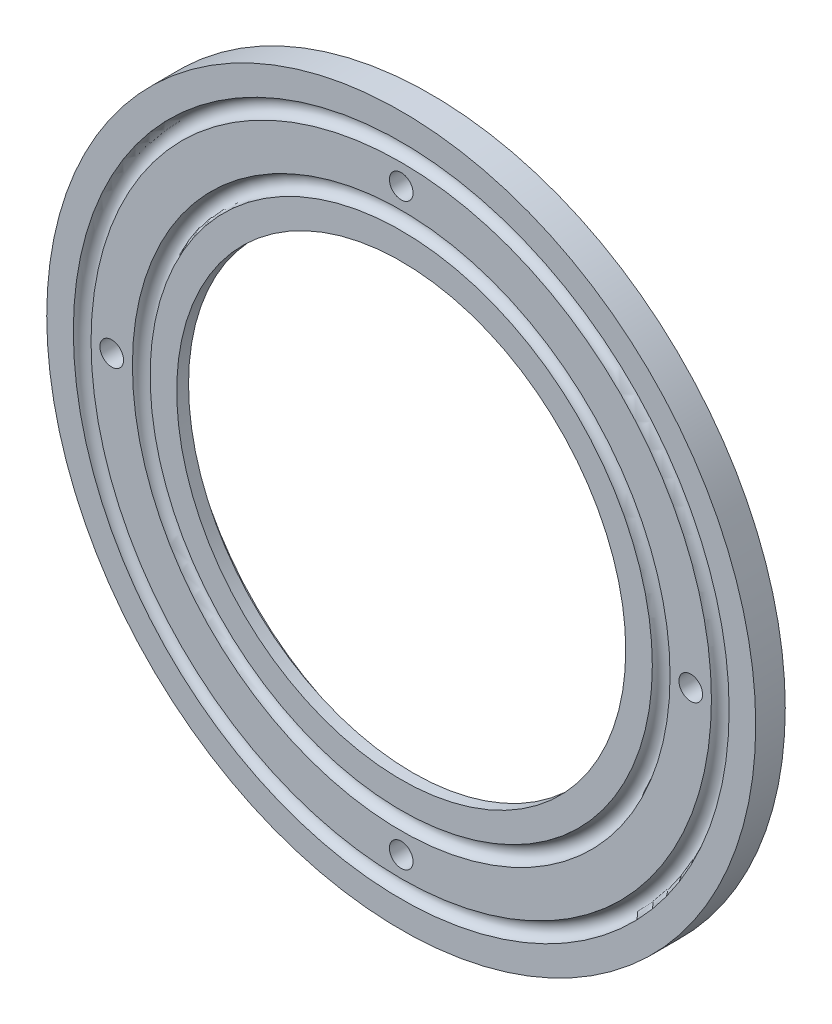
ISO-10303-21;
HEADER;
FILE_DESCRIPTION(('STEP AP214'),'2;1');
FILE_NAME('part.step','',(''),(''),'','','');
FILE_SCHEMA(('AUTOMOTIVE_DESIGN { 1 0 10303 214 1 1 1 1 }'));
ENDSEC;
DATA;
#1=APPLICATION_CONTEXT('core data for automotive mechanical design processes');
#2=APPLICATION_PROTOCOL_DEFINITION('international standard','automotive_design',2000,#1);
#3=PRODUCT_CONTEXT('',#1,'mechanical');
#4=PRODUCT('Part','Part','',(#3));
#5=PRODUCT_RELATED_PRODUCT_CATEGORY('part','',(#4));
#6=PRODUCT_DEFINITION_FORMATION('','',#4);
#7=PRODUCT_DEFINITION_CONTEXT('part definition',#1,'design');
#8=PRODUCT_DEFINITION('design','',#6,#7);
#9=PRODUCT_DEFINITION_SHAPE('','',#8);
#10=(LENGTH_UNIT() NAMED_UNIT(*) SI_UNIT(.MILLI.,.METRE.));
#11=(NAMED_UNIT(*) PLANE_ANGLE_UNIT() SI_UNIT($,.RADIAN.));
#12=(NAMED_UNIT(*) SI_UNIT($,.STERADIAN.) SOLID_ANGLE_UNIT());
#13=UNCERTAINTY_MEASURE_WITH_UNIT(LENGTH_MEASURE(1.E-05),#10,'distance_accuracy_value','');
#14=(GEOMETRIC_REPRESENTATION_CONTEXT(3) GLOBAL_UNCERTAINTY_ASSIGNED_CONTEXT((#13)) GLOBAL_UNIT_ASSIGNED_CONTEXT((#10,
#11,#12)) REPRESENTATION_CONTEXT('',''));
#15=CARTESIAN_POINT('',(0.,0.,0.));
#16=DIRECTION('',(0.,0.,1.));
#17=DIRECTION('',(1.,0.,0.));
#18=AXIS2_PLACEMENT_3D('',#15,#16,#17);
#19=CARTESIAN_POINT('',(0.,0.,0.));
#20=DIRECTION('',(0.,0.,1.));
#21=DIRECTION('',(1.,0.,0.));
#22=AXIS2_PLACEMENT_3D('',#19,#20,#21);
#23=CYLINDRICAL_SURFACE('',#22,38.);
#24=CARTESIAN_POINT('',(0.,0.,0.));
#25=DIRECTION('',(0.,0.,1.));
#26=DIRECTION('',(1.,0.,0.));
#27=AXIS2_PLACEMENT_3D('',#24,#25,#26);
#28=CIRCLE('',#27,38.);
#29=CARTESIAN_POINT('',(38.,0.,0.));
#30=VERTEX_POINT('',#29);
#31=EDGE_CURVE('E63',#30,#30,#28,.T.);
#32=ORIENTED_EDGE('',*,*,#31,.T.);
#33=EDGE_LOOP('',(#32));
#34=FACE_BOUND('',#33,.T.);
#35=CARTESIAN_POINT('',(0.,0.,-2.));
#36=DIRECTION('',(0.,0.,-1.));
#37=DIRECTION('',(-1.,0.,0.));
#38=AXIS2_PLACEMENT_3D('',#35,#36,#37);
#39=CIRCLE('',#38,38.);
#40=CARTESIAN_POINT('',(-38.,0.,-2.));
#41=VERTEX_POINT('',#40);
#42=EDGE_CURVE('E47',#41,#41,#39,.T.);
#43=ORIENTED_EDGE('',*,*,#42,.T.);
#44=EDGE_LOOP('',(#43));
#45=FACE_BOUND('',#44,.T.);
#46=ADVANCED_FACE('F43',(#34,#45),#23,.F.);
#47=CARTESIAN_POINT('',(0.,0.,0.));
#48=DIRECTION('',(0.,0.,1.));
#49=DIRECTION('',(1.,0.,0.));
#50=AXIS2_PLACEMENT_3D('',#47,#48,#49);
#51=TOROIDAL_SURFACE('',#50,54.,1.5);
#52=CARTESIAN_POINT('',(0.,0.,0.));
#53=DIRECTION('',(0.,0.,1.));
#54=DIRECTION('',(1.,0.,0.));
#55=AXIS2_PLACEMENT_3D('',#52,#53,#54);
#56=CIRCLE('',#55,55.5);
#57=CARTESIAN_POINT('',(55.5,0.,0.));
#58=VERTEX_POINT('',#57);
#59=EDGE_CURVE('E10',#58,#58,#56,.T.);
#60=ORIENTED_EDGE('',*,*,#59,.T.);
#61=EDGE_LOOP('',(#60));
#62=FACE_BOUND('',#61,.T.);
#63=CARTESIAN_POINT('',(0.,0.,0.));
#64=DIRECTION('',(0.,0.,1.));
#65=DIRECTION('',(1.,0.,0.));
#66=AXIS2_PLACEMENT_3D('',#63,#64,#65);
#67=CIRCLE('',#66,52.5);
#68=CARTESIAN_POINT('',(52.5,0.,0.));
#69=VERTEX_POINT('',#68);
#70=EDGE_CURVE('E75',#69,#69,#67,.T.);
#71=ORIENTED_EDGE('',*,*,#70,.F.);
#72=EDGE_LOOP('',(#71));
#73=FACE_BOUND('',#72,.T.);
#74=ADVANCED_FACE('F45',(#62,#73),#51,.F.);
#75=CARTESIAN_POINT('',(55.5,0.,0.));
#76=DIRECTION('',(0.,0.,1.));
#77=DIRECTION('',(1.,0.,0.));
#78=AXIS2_PLACEMENT_3D('',#75,#76,#77);
#79=PLANE('',#78);
#80=CARTESIAN_POINT('',(0.,0.,0.));
#81=DIRECTION('',(0.,0.,1.));
#82=DIRECTION('',(1.,0.,0.));
#83=AXIS2_PLACEMENT_3D('',#80,#81,#82);
#84=CIRCLE('',#83,60.);
#85=CARTESIAN_POINT('',(60.,0.,0.));
#86=VERTEX_POINT('',#85);
#87=EDGE_CURVE('E52',#86,#86,#84,.T.);
#88=ORIENTED_EDGE('',*,*,#87,.T.);
#89=EDGE_LOOP('',(#88));
#90=FACE_BOUND('',#89,.T.);
#91=ORIENTED_EDGE('',*,*,#59,.F.);
#92=EDGE_LOOP('',(#91));
#93=FACE_BOUND('',#92,.T.);
#94=ADVANCED_FACE('F143',(#90,#93),#79,.T.);
#95=CARTESIAN_POINT('',(0.,0.,0.));
#96=DIRECTION('',(0.,0.,1.));
#97=DIRECTION('',(1.,0.,0.));
#98=AXIS2_PLACEMENT_3D('',#95,#96,#97);
#99=CYLINDRICAL_SURFACE('',#98,60.);
#100=CARTESIAN_POINT('',(0.,0.,-5.));
#101=DIRECTION('',(0.,0.,1.));
#102=DIRECTION('',(1.,0.,0.));
#103=AXIS2_PLACEMENT_3D('',#100,#101,#102);
#104=CIRCLE('',#103,60.);
#105=CARTESIAN_POINT('',(60.,0.,-5.));
#106=VERTEX_POINT('',#105);
#107=EDGE_CURVE('E57',#106,#106,#104,.T.);
#108=ORIENTED_EDGE('',*,*,#107,.T.);
#109=EDGE_LOOP('',(#108));
#110=FACE_BOUND('',#109,.T.);
#111=ORIENTED_EDGE('',*,*,#87,.F.);
#112=EDGE_LOOP('',(#111));
#113=FACE_BOUND('',#112,.T.);
#114=ADVANCED_FACE('F150',(#110,#113),#99,.T.);
#115=CARTESIAN_POINT('',(38.,0.,-5.));
#116=DIRECTION('',(0.,0.,-1.));
#117=DIRECTION('',(-1.,0.,0.));
#118=AXIS2_PLACEMENT_3D('',#115,#116,#117);
#119=PLANE('',#118);
#120=CARTESIAN_POINT('',(0.,0.,-5.));
#121=DIRECTION('',(0.,0.,-1.));
#122=DIRECTION('',(-1.,0.,0.));
#123=AXIS2_PLACEMENT_3D('',#120,#121,#122);
#124=CIRCLE('',#123,42.);
#125=CARTESIAN_POINT('',(-42.,0.,-5.));
#126=VERTEX_POINT('',#125);
#127=EDGE_CURVE('E111',#126,#126,#124,.T.);
#128=ORIENTED_EDGE('',*,*,#127,.F.);
#129=EDGE_LOOP('',(#128));
#130=FACE_BOUND('',#129,.T.);
#131=CARTESIAN_POINT('',(49.,0.,-5.));
#132=DIRECTION('',(0.,0.,-1.));
#133=DIRECTION('',(-1.,0.,0.));
#134=AXIS2_PLACEMENT_3D('',#131,#132,#133);
#135=CIRCLE('',#134,2.);
#136=CARTESIAN_POINT('',(47.,0.,-5.));
#137=VERTEX_POINT('',#136);
#138=EDGE_CURVE('E79',#137,#137,#135,.T.);
#139=ORIENTED_EDGE('',*,*,#138,.F.);
#140=EDGE_LOOP('',(#139));
#141=FACE_BOUND('',#140,.T.);
#142=CARTESIAN_POINT('',(-49.,0.,-5.));
#143=DIRECTION('',(0.,0.,-1.));
#144=DIRECTION('',(-1.,0.,0.));
#145=AXIS2_PLACEMENT_3D('',#142,#143,#144);
#146=CIRCLE('',#145,2.);
#147=CARTESIAN_POINT('',(-51.,0.,-5.));
#148=VERTEX_POINT('',#147);
#149=EDGE_CURVE('E83',#148,#148,#146,.T.);
#150=ORIENTED_EDGE('',*,*,#149,.F.);
#151=EDGE_LOOP('',(#150));
#152=FACE_BOUND('',#151,.T.);
#153=CARTESIAN_POINT('',(0.,49.,-5.));
#154=DIRECTION('',(0.,0.,-1.));
#155=DIRECTION('',(-1.,0.,0.));
#156=AXIS2_PLACEMENT_3D('',#153,#154,#155);
#157=CIRCLE('',#156,2.);
#158=CARTESIAN_POINT('',(-2.,49.,-5.));
#159=VERTEX_POINT('',#158);
#160=EDGE_CURVE('E87',#159,#159,#157,.T.);
#161=ORIENTED_EDGE('',*,*,#160,.F.);
#162=EDGE_LOOP('',(#161));
#163=FACE_BOUND('',#162,.T.);
#164=CARTESIAN_POINT('',(0.,-49.,-5.));
#165=DIRECTION('',(0.,0.,-1.));
#166=DIRECTION('',(-1.,0.,0.));
#167=AXIS2_PLACEMENT_3D('',#164,#165,#166);
#168=CIRCLE('',#167,2.);
#169=CARTESIAN_POINT('',(-2.,-49.,-5.));
#170=VERTEX_POINT('',#169);
#171=EDGE_CURVE('E91',#170,#170,#168,.T.);
#172=ORIENTED_EDGE('',*,*,#171,.F.);
#173=EDGE_LOOP('',(#172));
#174=FACE_BOUND('',#173,.T.);
#175=ORIENTED_EDGE('',*,*,#107,.F.);
#176=EDGE_LOOP('',(#175));
#177=FACE_BOUND('',#176,.T.);
#178=ADVANCED_FACE('F148',(#130,#141,#152,#163,#174,#177),#119,.T.);
#179=CARTESIAN_POINT('',(38.,0.,0.));
#180=DIRECTION('',(0.,0.,1.));
#181=DIRECTION('',(1.,0.,0.));
#182=AXIS2_PLACEMENT_3D('',#179,#180,#181);
#183=PLANE('',#182);
#184=CARTESIAN_POINT('',(0.,0.,0.));
#185=DIRECTION('',(0.,0.,1.));
#186=DIRECTION('',(1.,0.,0.));
#187=AXIS2_PLACEMENT_3D('',#184,#185,#186);
#188=CIRCLE('',#187,42.5);
#189=CARTESIAN_POINT('',(42.5,0.,0.));
#190=VERTEX_POINT('',#189);
#191=EDGE_CURVE('E67',#190,#190,#188,.T.);
#192=ORIENTED_EDGE('',*,*,#191,.T.);
#193=EDGE_LOOP('',(#192));
#194=FACE_BOUND('',#193,.T.);
#195=ORIENTED_EDGE('',*,*,#31,.F.);
#196=EDGE_LOOP('',(#195));
#197=FACE_BOUND('',#196,.T.);
#198=ADVANCED_FACE('F146',(#194,#197),#183,.T.);
#199=CARTESIAN_POINT('',(0.,0.,0.));
#200=DIRECTION('',(0.,0.,1.));
#201=DIRECTION('',(1.,0.,0.));
#202=AXIS2_PLACEMENT_3D('',#199,#200,#201);
#203=TOROIDAL_SURFACE('',#202,44.,1.5);
#204=CARTESIAN_POINT('',(0.,0.,0.));
#205=DIRECTION('',(0.,0.,1.));
#206=DIRECTION('',(1.,0.,0.));
#207=AXIS2_PLACEMENT_3D('',#204,#205,#206);
#208=CIRCLE('',#207,45.5);
#209=CARTESIAN_POINT('',(45.5,0.,0.));
#210=VERTEX_POINT('',#209);
#211=EDGE_CURVE('E71',#210,#210,#208,.T.);
#212=ORIENTED_EDGE('',*,*,#211,.T.);
#213=EDGE_LOOP('',(#212));
#214=FACE_BOUND('',#213,.T.);
#215=ORIENTED_EDGE('',*,*,#191,.F.);
#216=EDGE_LOOP('',(#215));
#217=FACE_BOUND('',#216,.T.);
#218=ADVANCED_FACE('F176',(#214,#217),#203,.F.);
#219=CARTESIAN_POINT('',(45.5,0.,0.));
#220=DIRECTION('',(0.,0.,1.));
#221=DIRECTION('',(1.,0.,0.));
#222=AXIS2_PLACEMENT_3D('',#219,#220,#221);
#223=PLANE('',#222);
#224=CARTESIAN_POINT('',(49.,0.,0.));
#225=DIRECTION('',(0.,0.,1.));
#226=DIRECTION('',(1.,0.,0.));
#227=AXIS2_PLACEMENT_3D('',#224,#225,#226);
#228=CIRCLE('',#227,2.);
#229=CARTESIAN_POINT('',(51.,0.,0.));
#230=VERTEX_POINT('',#229);
#231=EDGE_CURVE('E95',#230,#230,#228,.T.);
#232=ORIENTED_EDGE('',*,*,#231,.F.);
#233=EDGE_LOOP('',(#232));
#234=FACE_BOUND('',#233,.T.);
#235=CARTESIAN_POINT('',(-49.,0.,0.));
#236=DIRECTION('',(0.,0.,1.));
#237=DIRECTION('',(1.,0.,0.));
#238=AXIS2_PLACEMENT_3D('',#235,#236,#237);
#239=CIRCLE('',#238,2.);
#240=CARTESIAN_POINT('',(-47.,0.,0.));
#241=VERTEX_POINT('',#240);
#242=EDGE_CURVE('E104',#241,#241,#239,.T.);
#243=ORIENTED_EDGE('',*,*,#242,.F.);
#244=EDGE_LOOP('',(#243));
#245=FACE_BOUND('',#244,.T.);
#246=CARTESIAN_POINT('',(0.,49.,0.));
#247=DIRECTION('',(0.,0.,1.));
#248=DIRECTION('',(1.,0.,0.));
#249=AXIS2_PLACEMENT_3D('',#246,#247,#248);
#250=CIRCLE('',#249,2.);
#251=CARTESIAN_POINT('',(2.,49.,0.));
#252=VERTEX_POINT('',#251);
#253=EDGE_CURVE('E100',#252,#252,#250,.T.);
#254=ORIENTED_EDGE('',*,*,#253,.F.);
#255=EDGE_LOOP('',(#254));
#256=FACE_BOUND('',#255,.T.);
#257=CARTESIAN_POINT('',(0.,-49.,0.));
#258=DIRECTION('',(0.,0.,1.));
#259=DIRECTION('',(1.,0.,0.));
#260=AXIS2_PLACEMENT_3D('',#257,#258,#259);
#261=CIRCLE('',#260,2.);
#262=CARTESIAN_POINT('',(2.,-49.,0.));
#263=VERTEX_POINT('',#262);
#264=EDGE_CURVE('E96',#263,#263,#261,.T.);
#265=ORIENTED_EDGE('',*,*,#264,.F.);
#266=EDGE_LOOP('',(#265));
#267=FACE_BOUND('',#266,.T.);
#268=ORIENTED_EDGE('',*,*,#70,.T.);
#269=EDGE_LOOP('',(#268));
#270=FACE_BOUND('',#269,.T.);
#271=ORIENTED_EDGE('',*,*,#211,.F.);
#272=EDGE_LOOP('',(#271));
#273=FACE_BOUND('',#272,.T.);
#274=ADVANCED_FACE('F184',(#234,#245,#256,#267,#270,#273),#223,.T.);
#275=CARTESIAN_POINT('',(0.,-49.,-10.));
#276=DIRECTION('',(0.,0.,1.));
#277=DIRECTION('',(1.,0.,0.));
#278=AXIS2_PLACEMENT_3D('',#275,#276,#277);
#279=CYLINDRICAL_SURFACE('',#278,2.);
#280=ORIENTED_EDGE('',*,*,#171,.T.);
#281=EDGE_LOOP('',(#280));
#282=FACE_BOUND('',#281,.T.);
#283=ORIENTED_EDGE('',*,*,#264,.T.);
#284=EDGE_LOOP('',(#283));
#285=FACE_BOUND('',#284,.T.);
#286=ADVANCED_FACE('F192',(#282,#285),#279,.F.);
#287=CARTESIAN_POINT('',(0.,49.,-10.));
#288=DIRECTION('',(0.,0.,1.));
#289=DIRECTION('',(1.,0.,0.));
#290=AXIS2_PLACEMENT_3D('',#287,#288,#289);
#291=CYLINDRICAL_SURFACE('',#290,2.);
#292=ORIENTED_EDGE('',*,*,#160,.T.);
#293=EDGE_LOOP('',(#292));
#294=FACE_BOUND('',#293,.T.);
#295=ORIENTED_EDGE('',*,*,#253,.T.);
#296=EDGE_LOOP('',(#295));
#297=FACE_BOUND('',#296,.T.);
#298=ADVANCED_FACE('F201',(#294,#297),#291,.F.);
#299=CARTESIAN_POINT('',(-49.,0.,-10.));
#300=DIRECTION('',(0.,0.,1.));
#301=DIRECTION('',(1.,0.,0.));
#302=AXIS2_PLACEMENT_3D('',#299,#300,#301);
#303=CYLINDRICAL_SURFACE('',#302,2.);
#304=ORIENTED_EDGE('',*,*,#149,.T.);
#305=EDGE_LOOP('',(#304));
#306=FACE_BOUND('',#305,.T.);
#307=ORIENTED_EDGE('',*,*,#242,.T.);
#308=EDGE_LOOP('',(#307));
#309=FACE_BOUND('',#308,.T.);
#310=ADVANCED_FACE('F210',(#306,#309),#303,.F.);
#311=CARTESIAN_POINT('',(49.,0.,-10.));
#312=DIRECTION('',(0.,0.,1.));
#313=DIRECTION('',(1.,0.,0.));
#314=AXIS2_PLACEMENT_3D('',#311,#312,#313);
#315=CYLINDRICAL_SURFACE('',#314,2.);
#316=ORIENTED_EDGE('',*,*,#138,.T.);
#317=EDGE_LOOP('',(#316));
#318=FACE_BOUND('',#317,.T.);
#319=ORIENTED_EDGE('',*,*,#231,.T.);
#320=EDGE_LOOP('',(#319));
#321=FACE_BOUND('',#320,.T.);
#322=ADVANCED_FACE('F132',(#318,#321),#315,.F.);
#323=CARTESIAN_POINT('',(0.,0.,-2.));
#324=DIRECTION('',(0.,0.,-1.));
#325=DIRECTION('',(-1.,0.,0.));
#326=AXIS2_PLACEMENT_3D('',#323,#324,#325);
#327=CYLINDRICAL_SURFACE('',#326,42.);
#328=CARTESIAN_POINT('',(0.,0.,-2.));
#329=DIRECTION('',(0.,0.,-1.));
#330=DIRECTION('',(-1.,0.,0.));
#331=AXIS2_PLACEMENT_3D('',#328,#329,#330);
#332=CIRCLE('',#331,42.);
#333=CARTESIAN_POINT('',(-42.,0.,-2.));
#334=VERTEX_POINT('',#333);
#335=EDGE_CURVE('E115',#334,#334,#332,.T.);
#336=ORIENTED_EDGE('',*,*,#335,.F.);
#337=EDGE_LOOP('',(#336));
#338=FACE_BOUND('',#337,.T.);
#339=ORIENTED_EDGE('',*,*,#127,.T.);
#340=EDGE_LOOP('',(#339));
#341=FACE_BOUND('',#340,.T.);
#342=ADVANCED_FACE('F127',(#338,#341),#327,.F.);
#343=CARTESIAN_POINT('',(0.,0.,-2.));
#344=DIRECTION('',(0.,0.,-1.));
#345=DIRECTION('',(-1.,0.,0.));
#346=AXIS2_PLACEMENT_3D('',#343,#344,#345);
#347=PLANE('',#346);
#348=ORIENTED_EDGE('',*,*,#42,.F.);
#349=EDGE_LOOP('',(#348));
#350=FACE_BOUND('',#349,.T.);
#351=ORIENTED_EDGE('',*,*,#335,.T.);
#352=EDGE_LOOP('',(#351));
#353=FACE_BOUND('',#352,.T.);
#354=ADVANCED_FACE('F125',(#350,#353),#347,.T.);
#355=CLOSED_SHELL('',(#46,#74,#94,#114,#178,#198,#218,#274,#286,#298,#310,#322,#342,#354));
#356=MANIFOLD_SOLID_BREP('B2',#355);
#357=ADVANCED_BREP_SHAPE_REPRESENTATION('',(#18,#356),#14);
#358=SHAPE_DEFINITION_REPRESENTATION(#9,#357);
ENDSEC;
END-ISO-10303-21;
